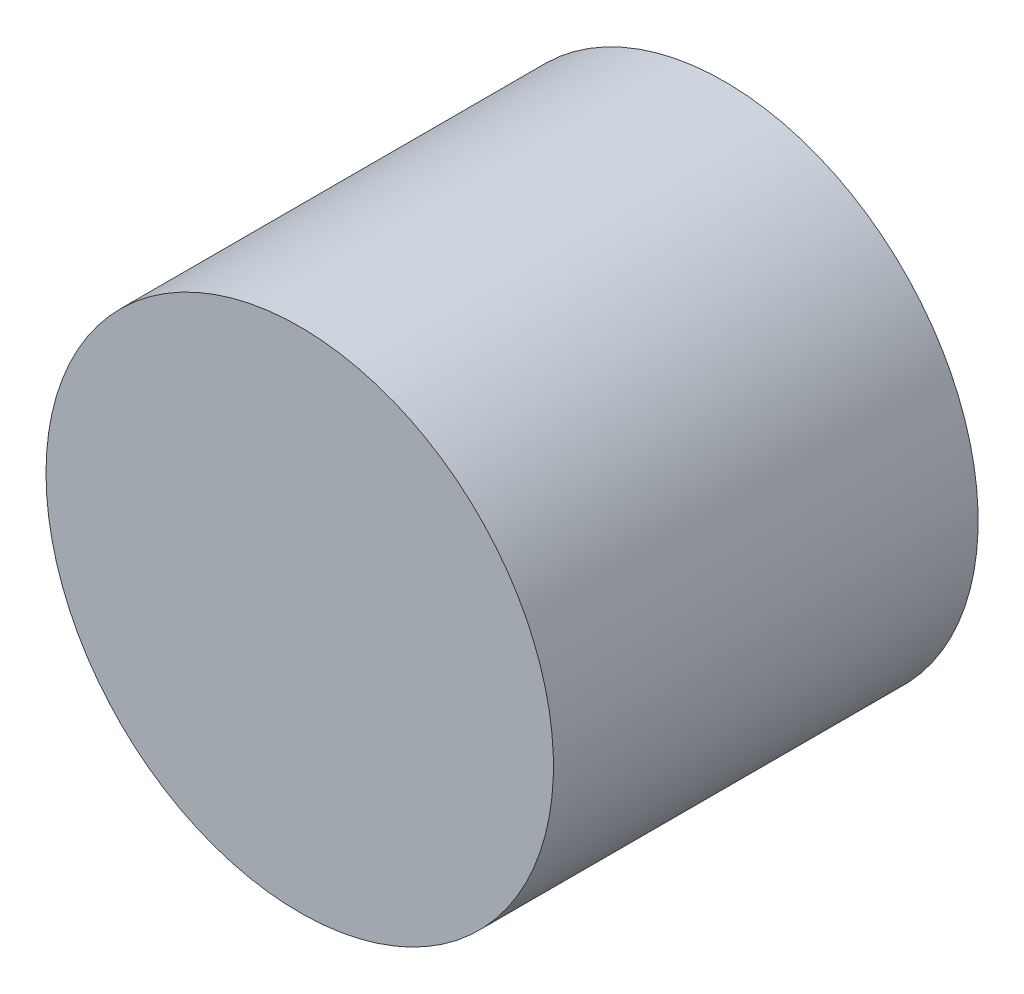
ISO-10303-21;
HEADER;
FILE_DESCRIPTION(('STEP AP214'),'2;1');
FILE_NAME('part.step','',(''),(''),'','','');
FILE_SCHEMA(('AUTOMOTIVE_DESIGN { 1 0 10303 214 1 1 1 1 }'));
ENDSEC;
DATA;
#1=APPLICATION_CONTEXT('core data for automotive mechanical design processes');
#2=APPLICATION_PROTOCOL_DEFINITION('international standard','automotive_design',2000,#1);
#3=PRODUCT_CONTEXT('',#1,'mechanical');
#4=PRODUCT('Part','Part','',(#3));
#5=PRODUCT_RELATED_PRODUCT_CATEGORY('part','',(#4));
#6=PRODUCT_DEFINITION_FORMATION('','',#4);
#7=PRODUCT_DEFINITION_CONTEXT('part definition',#1,'design');
#8=PRODUCT_DEFINITION('design','',#6,#7);
#9=PRODUCT_DEFINITION_SHAPE('','',#8);
#10=(LENGTH_UNIT() NAMED_UNIT(*) SI_UNIT(.MILLI.,.METRE.));
#11=(NAMED_UNIT(*) PLANE_ANGLE_UNIT() SI_UNIT($,.RADIAN.));
#12=(NAMED_UNIT(*) SI_UNIT($,.STERADIAN.) SOLID_ANGLE_UNIT());
#13=UNCERTAINTY_MEASURE_WITH_UNIT(LENGTH_MEASURE(1.E-05),#10,'distance_accuracy_value','');
#14=(GEOMETRIC_REPRESENTATION_CONTEXT(3) GLOBAL_UNCERTAINTY_ASSIGNED_CONTEXT((#13)) GLOBAL_UNIT_ASSIGNED_CONTEXT((#10,
#11,#12)) REPRESENTATION_CONTEXT('',''));
#15=CARTESIAN_POINT('',(0.,0.,0.));
#16=DIRECTION('',(0.,0.,1.));
#17=DIRECTION('',(1.,0.,0.));
#18=AXIS2_PLACEMENT_3D('',#15,#16,#17);
#19=CARTESIAN_POINT('',(-0.739379135703724,0.684339816773041,7.7));
#20=DIRECTION('',(0.,0.,-1.));
#21=DIRECTION('',(-1.,0.,0.));
#22=AXIS2_PLACEMENT_3D('',#19,#20,#21);
#23=CYLINDRICAL_SURFACE('',#22,4.60000000000001);
#24=CARTESIAN_POINT('',(-0.739379135703724,0.684339816773041,7.7));
#25=DIRECTION('',(0.,0.,1.));
#26=DIRECTION('',(1.,0.,0.));
#27=AXIS2_PLACEMENT_3D('',#24,#25,#26);
#28=CIRCLE('',#27,4.60000000000001);
#29=CARTESIAN_POINT('',(-5.33937913570373,0.684339816773041,7.7));
#30=VERTEX_POINT('',#29);
#31=EDGE_CURVE('E10',#30,#30,#28,.T.);
#32=CARTESIAN_POINT('',(-0.739379135703724,0.684339816773041,0.));
#33=DIRECTION('',(0.,0.,1.));
#34=DIRECTION('',(1.,0.,0.));
#35=AXIS2_PLACEMENT_3D('',#32,#33,#34);
#36=CIRCLE('',#35,4.60000000000001);
#37=CARTESIAN_POINT('',(-5.33937913570373,0.684339816773041,0.));
#38=VERTEX_POINT('',#37);
#39=EDGE_CURVE('E35',#38,#38,#36,.T.);
#40=CARTESIAN_POINT('',(-5.33937913570373,0.684339816773041,7.7));
#41=CARTESIAN_POINT('',(-5.33937913570373,0.684339816773041,7.61979166666667));
#42=CARTESIAN_POINT('',(-5.33937913570373,0.684339816773041,7.53958333333333));
#43=CARTESIAN_POINT('',(-5.33937913570373,0.684339816773041,7.37916666666667));
#44=CARTESIAN_POINT('',(-5.33937913570373,0.684339816773041,7.29895833333333));
#45=CARTESIAN_POINT('',(-5.33937913570373,0.684339816773041,7.13854166666667));
#46=CARTESIAN_POINT('',(-5.33937913570373,0.684339816773041,7.05833333333333));
#47=CARTESIAN_POINT('',(-5.33937913570373,0.684339816773041,6.89791666666667));
#48=CARTESIAN_POINT('',(-5.33937913570373,0.684339816773041,6.81770833333333));
#49=CARTESIAN_POINT('',(-5.33937913570373,0.684339816773041,6.65729166666667));
#50=CARTESIAN_POINT('',(-5.33937913570373,0.684339816773041,6.57708333333333));
#51=CARTESIAN_POINT('',(-5.33937913570373,0.684339816773041,6.41666666666667));
#52=CARTESIAN_POINT('',(-5.33937913570373,0.684339816773041,6.33645833333333));
#53=CARTESIAN_POINT('',(-5.33937913570373,0.684339816773041,6.17604166666667));
#54=CARTESIAN_POINT('',(-5.33937913570373,0.684339816773041,6.09583333333333));
#55=CARTESIAN_POINT('',(-5.33937913570373,0.684339816773041,5.93541666666667));
#56=CARTESIAN_POINT('',(-5.33937913570373,0.684339816773041,5.85520833333333));
#57=CARTESIAN_POINT('',(-5.33937913570373,0.684339816773041,5.69479166666667));
#58=CARTESIAN_POINT('',(-5.33937913570373,0.684339816773041,5.61458333333333));
#59=CARTESIAN_POINT('',(-5.33937913570373,0.684339816773041,5.45416666666667));
#60=CARTESIAN_POINT('',(-5.33937913570373,0.684339816773041,5.37395833333333));
#61=CARTESIAN_POINT('',(-5.33937913570373,0.684339816773041,5.21354166666667));
#62=CARTESIAN_POINT('',(-5.33937913570373,0.684339816773041,5.13333333333333));
#63=CARTESIAN_POINT('',(-5.33937913570373,0.684339816773041,4.97291666666667));
#64=CARTESIAN_POINT('',(-5.33937913570373,0.684339816773041,4.89270833333333));
#65=CARTESIAN_POINT('',(-5.33937913570373,0.684339816773041,4.73229166666667));
#66=CARTESIAN_POINT('',(-5.33937913570373,0.684339816773041,4.65208333333333));
#67=CARTESIAN_POINT('',(-5.33937913570373,0.684339816773041,4.49166666666667));
#68=CARTESIAN_POINT('',(-5.33937913570373,0.684339816773041,4.41145833333333));
#69=CARTESIAN_POINT('',(-5.33937913570373,0.684339816773041,4.25104166666667));
#70=CARTESIAN_POINT('',(-5.33937913570373,0.684339816773041,4.17083333333333));
#71=CARTESIAN_POINT('',(-5.33937913570373,0.684339816773041,4.01041666666667));
#72=CARTESIAN_POINT('',(-5.33937913570373,0.684339816773041,3.93020833333333));
#73=CARTESIAN_POINT('',(-5.33937913570373,0.684339816773041,3.76979166666667));
#74=CARTESIAN_POINT('',(-5.33937913570373,0.684339816773041,3.68958333333333));
#75=CARTESIAN_POINT('',(-5.33937913570373,0.684339816773041,3.52916666666667));
#76=CARTESIAN_POINT('',(-5.33937913570373,0.684339816773041,3.44895833333333));
#77=CARTESIAN_POINT('',(-5.33937913570373,0.684339816773041,3.28854166666667));
#78=CARTESIAN_POINT('',(-5.33937913570373,0.684339816773041,3.20833333333333));
#79=CARTESIAN_POINT('',(-5.33937913570373,0.684339816773041,3.04791666666667));
#80=CARTESIAN_POINT('',(-5.33937913570373,0.684339816773041,2.96770833333333));
#81=CARTESIAN_POINT('',(-5.33937913570373,0.684339816773041,2.80729166666667));
#82=CARTESIAN_POINT('',(-5.33937913570373,0.684339816773041,2.72708333333333));
#83=CARTESIAN_POINT('',(-5.33937913570373,0.684339816773041,2.56666666666667));
#84=CARTESIAN_POINT('',(-5.33937913570373,0.684339816773041,2.48645833333333));
#85=CARTESIAN_POINT('',(-5.33937913570373,0.684339816773041,2.32604166666667));
#86=CARTESIAN_POINT('',(-5.33937913570373,0.684339816773041,2.24583333333333));
#87=CARTESIAN_POINT('',(-5.33937913570373,0.684339816773041,2.08541666666667));
#88=CARTESIAN_POINT('',(-5.33937913570373,0.684339816773041,2.00520833333333));
#89=CARTESIAN_POINT('',(-5.33937913570373,0.684339816773041,1.84479166666667));
#90=CARTESIAN_POINT('',(-5.33937913570373,0.684339816773041,1.76458333333333));
#91=CARTESIAN_POINT('',(-5.33937913570373,0.684339816773041,1.60416666666667));
#92=CARTESIAN_POINT('',(-5.33937913570373,0.684339816773041,1.52395833333333));
#93=CARTESIAN_POINT('',(-5.33937913570373,0.684339816773041,1.36354166666667));
#94=CARTESIAN_POINT('',(-5.33937913570373,0.684339816773041,1.28333333333333));
#95=CARTESIAN_POINT('',(-5.33937913570373,0.684339816773041,1.12291666666667));
#96=CARTESIAN_POINT('',(-5.33937913570373,0.684339816773041,1.04270833333333));
#97=CARTESIAN_POINT('',(-5.33937913570373,0.684339816773041,0.882291666666666));
#98=CARTESIAN_POINT('',(-5.33937913570373,0.684339816773041,0.802083333333333));
#99=CARTESIAN_POINT('',(-5.33937913570373,0.684339816773041,0.641666666666666));
#100=CARTESIAN_POINT('',(-5.33937913570373,0.684339816773041,0.561458333333332));
#101=CARTESIAN_POINT('',(-5.33937913570373,0.684339816773041,0.401041666666666));
#102=CARTESIAN_POINT('',(-5.33937913570373,0.684339816773041,0.320833333333333));
#103=CARTESIAN_POINT('',(-5.33937913570373,0.684339816773041,0.160416666666666));
#104=CARTESIAN_POINT('',(-5.33937913570373,0.684339816773041,0.0802083333333325));
#105=CARTESIAN_POINT('',(-5.33937913570373,0.684339816773041,0.));
#106=B_SPLINE_CURVE_WITH_KNOTS('',3,(#40,#41,#42,#43,#44,#45,#46,#47,#48,#49,#50,#51,#52,#53,
#54,#55,#56,#57,#58,#59,#60,#61,#62,#63,#64,#65,#66,#67,#68,#69,#70,#71,#72,#73,#74,#75,#76,#77,
#78,#79,#80,#81,#82,#83,#84,#85,#86,#87,#88,#89,#90,#91,#92,#93,#94,#95,#96,#97,#98,#99,#100,
#101,#102,#103,#104,#105),.UNSPECIFIED.,.F.,.F.,(4,2,2,2,2,2,2,2,2,2,2,2,2,2,2,2,2,2,2,2,2,2,2,
2,2,2,2,2,2,2,2,2,4),(0.,0.240625,0.481250000000001,0.721875,0.962500000000001,1.203125,1.44375,
1.684375,1.925,2.165625,2.40625,2.646875,2.8875,3.128125,3.36875,3.609375,3.85,4.090625,4.33125,
4.571875,4.8125,5.053125,5.29375,5.534375,5.775,6.015625,6.25625,6.496875,6.7375,6.978125,
7.21875,7.459375,7.7),.UNSPECIFIED.);
#107=EDGE_CURVE('BSEAM32',#30,#38,#106,.T.);
#108=ORIENTED_EDGE('',*,*,#31,.F.);
#109=ORIENTED_EDGE('',*,*,#39,.T.);
#110=ORIENTED_EDGE('',*,*,#107,.T.);
#111=ORIENTED_EDGE('',*,*,#107,.F.);
#112=EDGE_LOOP('',(#108,#110,#109,#111));
#113=FACE_BOUND('',#112,.T.);
#114=ADVANCED_FACE('F32',(#113),#23,.T.);
#115=CARTESIAN_POINT('',(-0.739379135703724,0.684339816773041,7.7));
#116=DIRECTION('',(0.,0.,1.));
#117=DIRECTION('',(1.,0.,0.));
#118=AXIS2_PLACEMENT_3D('',#115,#116,#117);
#119=PLANE('',#118);
#120=ORIENTED_EDGE('',*,*,#31,.T.);
#121=EDGE_LOOP('',(#120));
#122=FACE_BOUND('',#121,.T.);
#123=ADVANCED_FACE('F47',(#122),#119,.T.);
#124=CARTESIAN_POINT('',(-0.739379135703724,0.684339816773041,0.));
#125=DIRECTION('',(0.,0.,1.));
#126=DIRECTION('',(1.,0.,0.));
#127=AXIS2_PLACEMENT_3D('',#124,#125,#126);
#128=PLANE('',#127);
#129=ORIENTED_EDGE('',*,*,#39,.F.);
#130=EDGE_LOOP('',(#129));
#131=FACE_BOUND('',#130,.T.);
#132=ADVANCED_FACE('F45',(#131),#128,.F.);
#133=CLOSED_SHELL('',(#114,#123,#132));
#134=MANIFOLD_SOLID_BREP('B2',#133);
#135=ADVANCED_BREP_SHAPE_REPRESENTATION('',(#18,#134),#14);
#136=SHAPE_DEFINITION_REPRESENTATION(#9,#135);
ENDSEC;
END-ISO-10303-21;
